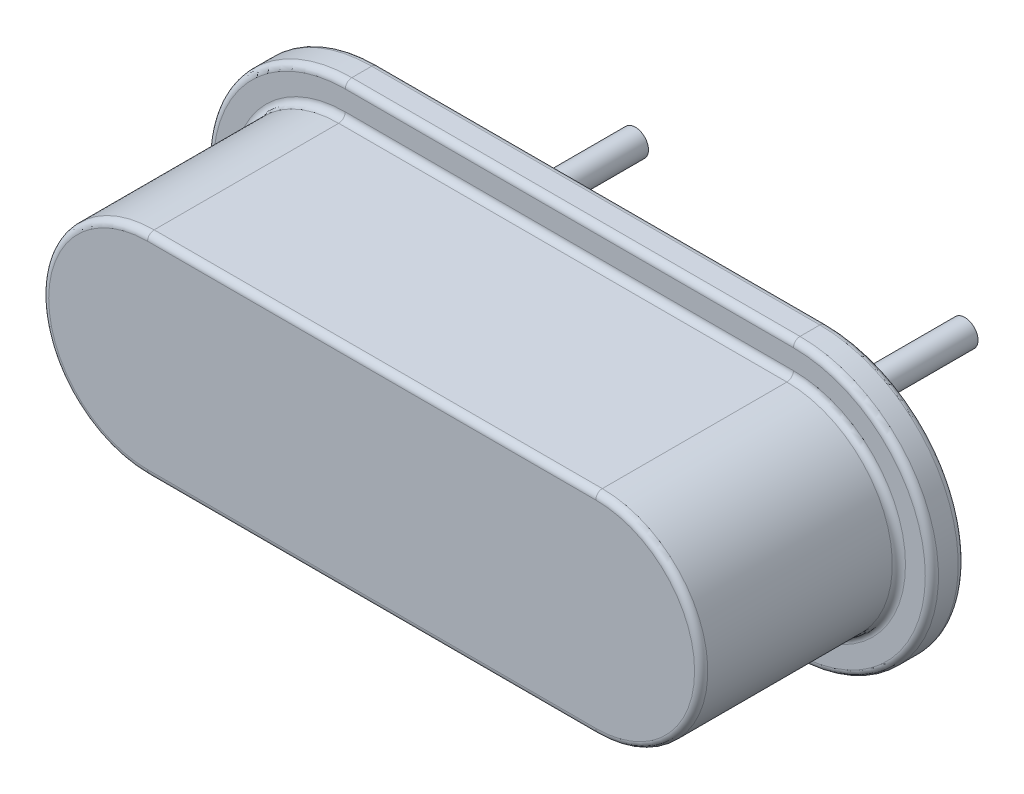
ISO-10303-21;
HEADER;
FILE_DESCRIPTION(('STEP AP214'),'2;1');
FILE_NAME('part.step','',(''),(''),'','','');
FILE_SCHEMA(('AUTOMOTIVE_DESIGN { 1 0 10303 214 1 1 1 1 }'));
ENDSEC;
DATA;
#1=APPLICATION_CONTEXT('core data for automotive mechanical design processes');
#2=APPLICATION_PROTOCOL_DEFINITION('international standard','automotive_design',2000,#1);
#3=PRODUCT_CONTEXT('',#1,'mechanical');
#4=PRODUCT('Part','Part','',(#3));
#5=PRODUCT_RELATED_PRODUCT_CATEGORY('part','',(#4));
#6=PRODUCT_DEFINITION_FORMATION('','',#4);
#7=PRODUCT_DEFINITION_CONTEXT('part definition',#1,'design');
#8=PRODUCT_DEFINITION('design','',#6,#7);
#9=PRODUCT_DEFINITION_SHAPE('','',#8);
#10=(LENGTH_UNIT() NAMED_UNIT(*) SI_UNIT(.MILLI.,.METRE.));
#11=(NAMED_UNIT(*) PLANE_ANGLE_UNIT() SI_UNIT($,.RADIAN.));
#12=(NAMED_UNIT(*) SI_UNIT($,.STERADIAN.) SOLID_ANGLE_UNIT());
#13=UNCERTAINTY_MEASURE_WITH_UNIT(LENGTH_MEASURE(1.E-05),#10,'distance_accuracy_value','');
#14=(GEOMETRIC_REPRESENTATION_CONTEXT(3) GLOBAL_UNCERTAINTY_ASSIGNED_CONTEXT((#13)) GLOBAL_UNIT_ASSIGNED_CONTEXT((#10,
#11,#12)) REPRESENTATION_CONTEXT('',''));
#15=CARTESIAN_POINT('',(0.,0.,0.));
#16=DIRECTION('',(0.,0.,1.));
#17=DIRECTION('',(1.,0.,0.));
#18=AXIS2_PLACEMENT_3D('',#15,#16,#17);
#19=CARTESIAN_POINT('',(3.4,0.,0.));
#20=DIRECTION('',(0.,0.,1.));
#21=DIRECTION('',(1.,0.,0.));
#22=AXIS2_PLACEMENT_3D('',#19,#20,#21);
#23=PLANE('',#22);
#24=DIRECTION('',(1.,0.,0.));
#25=VECTOR('',#24,1.);
#26=CARTESIAN_POINT('',(3.4,-2.,0.));
#27=LINE('',#26,#25);
#28=CARTESIAN_POINT('',(3.4,-2.,0.));
#29=VERTEX_POINT('',#28);
#30=CARTESIAN_POINT('',(-3.4,-2.,0.));
#31=VERTEX_POINT('',#30);
#32=EDGE_CURVE('E282',#29,#31,#27,.F.);
#33=ORIENTED_EDGE('',*,*,#32,.T.);
#34=CARTESIAN_POINT('',(-3.4,0.,0.));
#35=DIRECTION('',(0.,0.,1.));
#36=DIRECTION('',(1.,0.,0.));
#37=AXIS2_PLACEMENT_3D('',#34,#35,#36);
#38=CIRCLE('',#37,2.);
#39=CARTESIAN_POINT('',(-3.4,2.,0.));
#40=VERTEX_POINT('',#39);
#41=EDGE_CURVE('E288',#31,#40,#38,.F.);
#42=ORIENTED_EDGE('',*,*,#41,.T.);
#43=DIRECTION('',(-1.,0.,0.));
#44=VECTOR('',#43,1.);
#45=CARTESIAN_POINT('',(3.4,2.,0.));
#46=LINE('',#45,#44);
#47=CARTESIAN_POINT('',(3.4,2.,0.));
#48=VERTEX_POINT('',#47);
#49=EDGE_CURVE('E286',#40,#48,#46,.F.);
#50=ORIENTED_EDGE('',*,*,#49,.T.);
#51=CARTESIAN_POINT('',(3.4,0.,0.));
#52=DIRECTION('',(0.,0.,1.));
#53=DIRECTION('',(1.,0.,0.));
#54=AXIS2_PLACEMENT_3D('',#51,#52,#53);
#55=CIRCLE('',#54,2.);
#56=EDGE_CURVE('E284',#48,#29,#55,.F.);
#57=ORIENTED_EDGE('',*,*,#56,.T.);
#58=EDGE_LOOP('',(#33,#42,#50,#57));
#59=FACE_BOUND('',#58,.T.);
#60=CARTESIAN_POINT('',(2.49999999999995,0.,0.));
#61=DIRECTION('',(0.,0.,1.));
#62=DIRECTION('',(1.,0.,0.));
#63=AXIS2_PLACEMENT_3D('',#60,#61,#62);
#64=CIRCLE('',#63,0.2);
#65=CARTESIAN_POINT('',(2.69999999999995,0.,0.));
#66=VERTEX_POINT('',#65);
#67=EDGE_CURVE('E276',#66,#66,#64,.F.);
#68=ORIENTED_EDGE('',*,*,#67,.F.);
#69=EDGE_LOOP('',(#68));
#70=FACE_BOUND('',#69,.T.);
#71=CARTESIAN_POINT('',(-2.49999999999995,0.,0.));
#72=DIRECTION('',(0.,0.,1.));
#73=DIRECTION('',(1.,0.,0.));
#74=AXIS2_PLACEMENT_3D('',#71,#72,#73);
#75=CIRCLE('',#74,0.2);
#76=CARTESIAN_POINT('',(-2.29999999999995,0.,0.));
#77=VERTEX_POINT('',#76);
#78=EDGE_CURVE('E186',#77,#77,#75,.F.);
#79=ORIENTED_EDGE('',*,*,#78,.F.);
#80=EDGE_LOOP('',(#79));
#81=FACE_BOUND('',#80,.T.);
#82=ADVANCED_FACE('F35',(#59,#70,#81),#23,.F.);
#83=CARTESIAN_POINT('',(3.4,0.,0.5));
#84=DIRECTION('',(0.,0.,1.));
#85=DIRECTION('',(1.,0.,0.));
#86=AXIS2_PLACEMENT_3D('',#83,#84,#85);
#87=PLANE('',#86);
#88=DIRECTION('',(-1.,0.,0.));
#89=VECTOR('',#88,1.);
#90=CARTESIAN_POINT('',(-3.4,2.,0.5));
#91=LINE('',#90,#89);
#92=CARTESIAN_POINT('',(3.4,2.,0.5));
#93=VERTEX_POINT('',#92);
#94=CARTESIAN_POINT('',(-3.4,2.,0.5));
#95=VERTEX_POINT('',#94);
#96=EDGE_CURVE('E311',#93,#95,#91,.T.);
#97=ORIENTED_EDGE('',*,*,#96,.T.);
#98=CARTESIAN_POINT('',(-3.4,0.,0.5));
#99=DIRECTION('',(0.,0.,1.));
#100=DIRECTION('',(1.,0.,0.));
#101=AXIS2_PLACEMENT_3D('',#98,#99,#100);
#102=CIRCLE('',#101,2.);
#103=CARTESIAN_POINT('',(-3.4,-2.,0.5));
#104=VERTEX_POINT('',#103);
#105=EDGE_CURVE('E313',#95,#104,#102,.T.);
#106=ORIENTED_EDGE('',*,*,#105,.T.);
#107=DIRECTION('',(1.,0.,0.));
#108=VECTOR('',#107,1.);
#109=CARTESIAN_POINT('',(3.4,-2.,0.5));
#110=LINE('',#109,#108);
#111=CARTESIAN_POINT('',(3.4,-2.,0.5));
#112=VERTEX_POINT('',#111);
#113=EDGE_CURVE('E189',#104,#112,#110,.T.);
#114=ORIENTED_EDGE('',*,*,#113,.T.);
#115=CARTESIAN_POINT('',(3.4,0.,0.5));
#116=DIRECTION('',(0.,0.,1.));
#117=DIRECTION('',(1.,0.,0.));
#118=AXIS2_PLACEMENT_3D('',#115,#116,#117);
#119=CIRCLE('',#118,2.);
#120=EDGE_CURVE('E309',#112,#93,#119,.T.);
#121=ORIENTED_EDGE('',*,*,#120,.T.);
#122=EDGE_LOOP('',(#97,#106,#114,#121));
#123=FACE_BOUND('',#122,.T.);
#124=DIRECTION('',(1.,0.,0.));
#125=VECTOR('',#124,1.);
#126=CARTESIAN_POINT('',(3.4,-1.7,0.5));
#127=LINE('',#126,#125);
#128=CARTESIAN_POINT('',(3.4,-1.7,0.5));
#129=VERTEX_POINT('',#128);
#130=CARTESIAN_POINT('',(-3.39999999999999,-1.7,0.5));
#131=VERTEX_POINT('',#130);
#132=EDGE_CURVE('E299',#129,#131,#127,.F.);
#133=ORIENTED_EDGE('',*,*,#132,.T.);
#134=CARTESIAN_POINT('',(-3.4,0.,0.5));
#135=DIRECTION('',(0.,0.,1.));
#136=DIRECTION('',(1.,0.,0.));
#137=AXIS2_PLACEMENT_3D('',#134,#135,#136);
#138=CIRCLE('',#137,1.7);
#139=CARTESIAN_POINT('',(-3.40000000000001,1.7,0.5));
#140=VERTEX_POINT('',#139);
#141=EDGE_CURVE('E305',#131,#140,#138,.F.);
#142=ORIENTED_EDGE('',*,*,#141,.T.);
#143=DIRECTION('',(-1.,0.,0.));
#144=VECTOR('',#143,1.);
#145=CARTESIAN_POINT('',(3.4,1.7,0.5));
#146=LINE('',#145,#144);
#147=CARTESIAN_POINT('',(3.4,1.7,0.5));
#148=VERTEX_POINT('',#147);
#149=EDGE_CURVE('E303',#140,#148,#146,.F.);
#150=ORIENTED_EDGE('',*,*,#149,.T.);
#151=CARTESIAN_POINT('',(3.4,0.,0.5));
#152=DIRECTION('',(0.,0.,1.));
#153=DIRECTION('',(1.,0.,0.));
#154=AXIS2_PLACEMENT_3D('',#151,#152,#153);
#155=CIRCLE('',#154,1.7);
#156=EDGE_CURVE('E301',#148,#129,#155,.F.);
#157=ORIENTED_EDGE('',*,*,#156,.T.);
#158=EDGE_LOOP('',(#133,#142,#150,#157));
#159=FACE_BOUND('',#158,.T.);
#160=ADVANCED_FACE('F364',(#123,#159),#87,.T.);
#161=CARTESIAN_POINT('',(3.4,0.,0.5));
#162=DIRECTION('',(0.,0.,-1.));
#163=DIRECTION('',(-1.,0.,0.));
#164=AXIS2_PLACEMENT_3D('',#161,#162,#163);
#165=CYLINDRICAL_SURFACE('',#164,2.1);
#166=DIRECTION('',(0.,0.,-1.));
#167=VECTOR('',#166,1.);
#168=CARTESIAN_POINT('',(3.4,-2.1,0.5));
#169=LINE('',#168,#167);
#170=CARTESIAN_POINT('',(3.4,-2.1,0.4));
#171=VERTEX_POINT('',#170);
#172=CARTESIAN_POINT('',(3.4,-2.1,0.1));
#173=VERTEX_POINT('',#172);
#174=EDGE_CURVE('E158',#171,#173,#169,.T.);
#175=ORIENTED_EDGE('',*,*,#174,.T.);
#176=CARTESIAN_POINT('',(3.4,0.,0.1));
#177=DIRECTION('',(0.,0.,1.));
#178=DIRECTION('',(1.,0.,0.));
#179=AXIS2_PLACEMENT_3D('',#176,#177,#178);
#180=CIRCLE('',#179,2.1);
#181=CARTESIAN_POINT('',(3.4,2.1,0.1));
#182=VERTEX_POINT('',#181);
#183=EDGE_CURVE('E297',#173,#182,#180,.T.);
#184=ORIENTED_EDGE('',*,*,#183,.T.);
#185=DIRECTION('',(0.,0.,-1.));
#186=VECTOR('',#185,1.);
#187=CARTESIAN_POINT('',(3.4,2.1,0.5));
#188=LINE('',#187,#186);
#189=CARTESIAN_POINT('',(3.4,2.1,0.4));
#190=VERTEX_POINT('',#189);
#191=EDGE_CURVE('E273',#190,#182,#188,.T.);
#192=ORIENTED_EDGE('',*,*,#191,.F.);
#193=CARTESIAN_POINT('',(3.4,0.,0.4));
#194=DIRECTION('',(0.,0.,1.));
#195=DIRECTION('',(1.,0.,0.));
#196=AXIS2_PLACEMENT_3D('',#193,#194,#195);
#197=CIRCLE('',#196,2.1);
#198=EDGE_CURVE('E295',#190,#171,#197,.F.);
#199=ORIENTED_EDGE('',*,*,#198,.T.);
#200=EDGE_LOOP('',(#175,#184,#192,#199));
#201=FACE_BOUND('',#200,.T.);
#202=ADVANCED_FACE('F366',(#201),#165,.T.);
#203=CARTESIAN_POINT('',(3.4,2.1,0.5));
#204=DIRECTION('',(0.,-1.,0.));
#205=DIRECTION('',(0.,0.,-1.));
#206=AXIS2_PLACEMENT_3D('',#203,#204,#205);
#207=PLANE('',#206);
#208=ORIENTED_EDGE('',*,*,#191,.T.);
#209=DIRECTION('',(-1.,0.,0.));
#210=VECTOR('',#209,1.);
#211=CARTESIAN_POINT('',(3.4,2.1,0.1));
#212=LINE('',#211,#210);
#213=CARTESIAN_POINT('',(-3.4,2.1,0.1));
#214=VERTEX_POINT('',#213);
#215=EDGE_CURVE('E293',#182,#214,#212,.T.);
#216=ORIENTED_EDGE('',*,*,#215,.T.);
#217=DIRECTION('',(0.,0.,-1.));
#218=VECTOR('',#217,1.);
#219=CARTESIAN_POINT('',(-3.4,2.1,0.5));
#220=LINE('',#219,#218);
#221=CARTESIAN_POINT('',(-3.4,2.1,0.4));
#222=VERTEX_POINT('',#221);
#223=EDGE_CURVE('E176',#222,#214,#220,.T.);
#224=ORIENTED_EDGE('',*,*,#223,.F.);
#225=DIRECTION('',(-1.,0.,0.));
#226=VECTOR('',#225,1.);
#227=CARTESIAN_POINT('',(3.4,2.1,0.4));
#228=LINE('',#227,#226);
#229=EDGE_CURVE('E291',#222,#190,#228,.F.);
#230=ORIENTED_EDGE('',*,*,#229,.T.);
#231=EDGE_LOOP('',(#208,#216,#224,#230));
#232=FACE_BOUND('',#231,.T.);
#233=ADVANCED_FACE('F373',(#232),#207,.F.);
#234=CARTESIAN_POINT('',(-3.4,0.,0.5));
#235=DIRECTION('',(0.,0.,-1.));
#236=DIRECTION('',(-1.,0.,0.));
#237=AXIS2_PLACEMENT_3D('',#234,#235,#236);
#238=CYLINDRICAL_SURFACE('',#237,2.1);
#239=ORIENTED_EDGE('',*,*,#223,.T.);
#240=CARTESIAN_POINT('',(-3.4,0.,0.1));
#241=DIRECTION('',(0.,0.,1.));
#242=DIRECTION('',(1.,0.,0.));
#243=AXIS2_PLACEMENT_3D('',#240,#241,#242);
#244=CIRCLE('',#243,2.1);
#245=CARTESIAN_POINT('',(-3.4,-2.1,0.1));
#246=VERTEX_POINT('',#245);
#247=EDGE_CURVE('E175',#214,#246,#244,.T.);
#248=ORIENTED_EDGE('',*,*,#247,.T.);
#249=DIRECTION('',(0.,0.,-1.));
#250=VECTOR('',#249,1.);
#251=CARTESIAN_POINT('',(-3.4,-2.1,0.5));
#252=LINE('',#251,#250);
#253=CARTESIAN_POINT('',(-3.4,-2.1,0.4));
#254=VERTEX_POINT('',#253);
#255=EDGE_CURVE('E156',#254,#246,#252,.T.);
#256=ORIENTED_EDGE('',*,*,#255,.F.);
#257=CARTESIAN_POINT('',(-3.4,0.,0.4));
#258=DIRECTION('',(0.,0.,1.));
#259=DIRECTION('',(1.,0.,0.));
#260=AXIS2_PLACEMENT_3D('',#257,#258,#259);
#261=CIRCLE('',#260,2.1);
#262=EDGE_CURVE('E172',#254,#222,#261,.F.);
#263=ORIENTED_EDGE('',*,*,#262,.T.);
#264=EDGE_LOOP('',(#239,#248,#256,#263));
#265=FACE_BOUND('',#264,.T.);
#266=ADVANCED_FACE('F171',(#265),#238,.T.);
#267=CARTESIAN_POINT('',(3.4,-2.1,0.5));
#268=DIRECTION('',(0.,1.,0.));
#269=DIRECTION('',(0.,0.,1.));
#270=AXIS2_PLACEMENT_3D('',#267,#268,#269);
#271=PLANE('',#270);
#272=ORIENTED_EDGE('',*,*,#255,.T.);
#273=DIRECTION('',(1.,0.,0.));
#274=VECTOR('',#273,1.);
#275=CARTESIAN_POINT('',(3.4,-2.1,0.1));
#276=LINE('',#275,#274);
#277=EDGE_CURVE('E163',#246,#173,#276,.T.);
#278=ORIENTED_EDGE('',*,*,#277,.T.);
#279=ORIENTED_EDGE('',*,*,#174,.F.);
#280=DIRECTION('',(1.,0.,0.));
#281=VECTOR('',#280,1.);
#282=CARTESIAN_POINT('',(-3.4,-2.1,0.4));
#283=LINE('',#282,#281);
#284=EDGE_CURVE('E153',#171,#254,#283,.F.);
#285=ORIENTED_EDGE('',*,*,#284,.T.);
#286=EDGE_LOOP('',(#272,#278,#279,#285));
#287=FACE_BOUND('',#286,.T.);
#288=ADVANCED_FACE('F155',(#287),#271,.F.);
#289=CARTESIAN_POINT('',(3.4,0.,3.5));
#290=DIRECTION('',(0.,0.,-1.));
#291=DIRECTION('',(-1.,0.,0.));
#292=AXIS2_PLACEMENT_3D('',#289,#290,#291);
#293=CYLINDRICAL_SURFACE('',#292,1.6);
#294=DIRECTION('',(0.,0.,-1.));
#295=VECTOR('',#294,1.);
#296=CARTESIAN_POINT('',(3.4,-1.6,3.5));
#297=LINE('',#296,#295);
#298=CARTESIAN_POINT('',(3.4,-1.6,3.4));
#299=VERTEX_POINT('',#298);
#300=CARTESIAN_POINT('',(3.4,-1.6,0.6));
#301=VERTEX_POINT('',#300);
#302=EDGE_CURVE('E258',#299,#301,#297,.T.);
#303=ORIENTED_EDGE('',*,*,#302,.T.);
#304=CARTESIAN_POINT('',(3.4,0.,0.6));
#305=DIRECTION('',(0.,0.,1.));
#306=DIRECTION('',(1.,0.,0.));
#307=AXIS2_PLACEMENT_3D('',#304,#305,#306);
#308=CIRCLE('',#307,1.6);
#309=CARTESIAN_POINT('',(3.4,1.6,0.6));
#310=VERTEX_POINT('',#309);
#311=EDGE_CURVE('E325',#301,#310,#308,.T.);
#312=ORIENTED_EDGE('',*,*,#311,.T.);
#313=DIRECTION('',(0.,0.,-1.));
#314=VECTOR('',#313,1.);
#315=CARTESIAN_POINT('',(3.4,1.6,3.5));
#316=LINE('',#315,#314);
#317=CARTESIAN_POINT('',(3.4,1.6,3.4));
#318=VERTEX_POINT('',#317);
#319=EDGE_CURVE('E268',#318,#310,#316,.T.);
#320=ORIENTED_EDGE('',*,*,#319,.F.);
#321=CARTESIAN_POINT('',(3.4,0.,3.4));
#322=DIRECTION('',(0.,0.,1.));
#323=DIRECTION('',(1.,0.,0.));
#324=AXIS2_PLACEMENT_3D('',#321,#322,#323);
#325=CIRCLE('',#324,1.6);
#326=EDGE_CURVE('E225',#318,#299,#325,.F.);
#327=ORIENTED_EDGE('',*,*,#326,.T.);
#328=EDGE_LOOP('',(#303,#312,#320,#327));
#329=FACE_BOUND('',#328,.T.);
#330=ADVANCED_FACE('F356',(#329),#293,.T.);
#331=CARTESIAN_POINT('',(-3.40000000000001,1.6,3.5));
#332=DIRECTION('',(0.,-1.,0.));
#333=DIRECTION('',(0.,0.,-1.));
#334=AXIS2_PLACEMENT_3D('',#331,#332,#333);
#335=PLANE('',#334);
#336=ORIENTED_EDGE('',*,*,#319,.T.);
#337=DIRECTION('',(-1.,0.,0.));
#338=VECTOR('',#337,1.);
#339=CARTESIAN_POINT('',(-3.40000000000001,1.6,0.6));
#340=LINE('',#339,#338);
#341=CARTESIAN_POINT('',(-3.40000000000001,1.6,0.6));
#342=VERTEX_POINT('',#341);
#343=EDGE_CURVE('E322',#310,#342,#340,.T.);
#344=ORIENTED_EDGE('',*,*,#343,.T.);
#345=DIRECTION('',(0.,0.,-1.));
#346=VECTOR('',#345,1.);
#347=CARTESIAN_POINT('',(-3.40000000000001,1.6,3.5));
#348=LINE('',#347,#346);
#349=CARTESIAN_POINT('',(-3.40000000000001,1.6,3.4));
#350=VERTEX_POINT('',#349);
#351=EDGE_CURVE('E265',#350,#342,#348,.T.);
#352=ORIENTED_EDGE('',*,*,#351,.F.);
#353=DIRECTION('',(-1.,0.,0.));
#354=VECTOR('',#353,1.);
#355=CARTESIAN_POINT('',(3.4,1.6,3.4));
#356=LINE('',#355,#354);
#357=EDGE_CURVE('E320',#350,#318,#356,.F.);
#358=ORIENTED_EDGE('',*,*,#357,.T.);
#359=EDGE_LOOP('',(#336,#344,#352,#358));
#360=FACE_BOUND('',#359,.T.);
#361=ADVANCED_FACE('F340',(#360),#335,.F.);
#362=CARTESIAN_POINT('',(-3.4,0.,3.5));
#363=DIRECTION('',(0.,0.,-1.));
#364=DIRECTION('',(-1.,0.,0.));
#365=AXIS2_PLACEMENT_3D('',#362,#363,#364);
#366=CYLINDRICAL_SURFACE('',#365,1.6);
#367=ORIENTED_EDGE('',*,*,#351,.T.);
#368=CARTESIAN_POINT('',(-3.4,0.,0.6));
#369=DIRECTION('',(0.,0.,1.));
#370=DIRECTION('',(1.,0.,0.));
#371=AXIS2_PLACEMENT_3D('',#368,#369,#370);
#372=CIRCLE('',#371,1.6);
#373=CARTESIAN_POINT('',(-3.39999999999999,-1.6,0.6));
#374=VERTEX_POINT('',#373);
#375=EDGE_CURVE('E317',#342,#374,#372,.T.);
#376=ORIENTED_EDGE('',*,*,#375,.T.);
#377=DIRECTION('',(0.,0.,-1.));
#378=VECTOR('',#377,1.);
#379=CARTESIAN_POINT('',(-3.39999999999999,-1.6,3.5));
#380=LINE('',#379,#378);
#381=CARTESIAN_POINT('',(-3.39999999999999,-1.6,3.4));
#382=VERTEX_POINT('',#381);
#383=EDGE_CURVE('E263',#382,#374,#380,.T.);
#384=ORIENTED_EDGE('',*,*,#383,.F.);
#385=CARTESIAN_POINT('',(-3.4,0.,3.4));
#386=DIRECTION('',(0.,0.,1.));
#387=DIRECTION('',(1.,0.,0.));
#388=AXIS2_PLACEMENT_3D('',#385,#386,#387);
#389=CIRCLE('',#388,1.6);
#390=EDGE_CURVE('E315',#382,#350,#389,.F.);
#391=ORIENTED_EDGE('',*,*,#390,.T.);
#392=EDGE_LOOP('',(#367,#376,#384,#391));
#393=FACE_BOUND('',#392,.T.);
#394=ADVANCED_FACE('F338',(#393),#366,.T.);
#395=CARTESIAN_POINT('',(-3.39999999999999,-1.6,3.5));
#396=DIRECTION('',(0.,1.,0.));
#397=DIRECTION('',(0.,0.,1.));
#398=AXIS2_PLACEMENT_3D('',#395,#396,#397);
#399=PLANE('',#398);
#400=ORIENTED_EDGE('',*,*,#383,.T.);
#401=DIRECTION('',(1.,0.,0.));
#402=VECTOR('',#401,1.);
#403=CARTESIAN_POINT('',(-3.39999999999999,-1.6,0.6));
#404=LINE('',#403,#402);
#405=EDGE_CURVE('E11',#374,#301,#404,.T.);
#406=ORIENTED_EDGE('',*,*,#405,.T.);
#407=ORIENTED_EDGE('',*,*,#302,.F.);
#408=DIRECTION('',(1.,0.,0.));
#409=VECTOR('',#408,1.);
#410=CARTESIAN_POINT('',(-3.39999999999999,-1.6,3.4));
#411=LINE('',#410,#409);
#412=EDGE_CURVE('E44',#299,#382,#411,.F.);
#413=ORIENTED_EDGE('',*,*,#412,.T.);
#414=EDGE_LOOP('',(#400,#406,#407,#413));
#415=FACE_BOUND('',#414,.T.);
#416=ADVANCED_FACE('F352',(#415),#399,.F.);
#417=CARTESIAN_POINT('',(3.4,0.,3.5));
#418=DIRECTION('',(0.,0.,1.));
#419=DIRECTION('',(1.,0.,0.));
#420=AXIS2_PLACEMENT_3D('',#417,#418,#419);
#421=PLANE('',#420);
#422=CARTESIAN_POINT('',(3.4,0.,3.5));
#423=DIRECTION('',(0.,0.,1.));
#424=DIRECTION('',(1.,0.,0.));
#425=AXIS2_PLACEMENT_3D('',#422,#423,#424);
#426=CIRCLE('',#425,1.5);
#427=CARTESIAN_POINT('',(3.4,-1.5,3.5));
#428=VERTEX_POINT('',#427);
#429=CARTESIAN_POINT('',(3.4,1.5,3.5));
#430=VERTEX_POINT('',#429);
#431=EDGE_CURVE('E52',#428,#430,#426,.T.);
#432=ORIENTED_EDGE('',*,*,#431,.T.);
#433=DIRECTION('',(-1.,0.,0.));
#434=VECTOR('',#433,1.);
#435=CARTESIAN_POINT('',(-3.40000000000001,1.5,3.5));
#436=LINE('',#435,#434);
#437=CARTESIAN_POINT('',(-3.40000000000001,1.5,3.5));
#438=VERTEX_POINT('',#437);
#439=EDGE_CURVE('E164',#430,#438,#436,.T.);
#440=ORIENTED_EDGE('',*,*,#439,.T.);
#441=CARTESIAN_POINT('',(-3.4,0.,3.5));
#442=DIRECTION('',(0.,0.,1.));
#443=DIRECTION('',(1.,0.,0.));
#444=AXIS2_PLACEMENT_3D('',#441,#442,#443);
#445=CIRCLE('',#444,1.5);
#446=CARTESIAN_POINT('',(-3.39999999999999,-1.5,3.5));
#447=VERTEX_POINT('',#446);
#448=EDGE_CURVE('E328',#438,#447,#445,.T.);
#449=ORIENTED_EDGE('',*,*,#448,.T.);
#450=DIRECTION('',(1.,0.,0.));
#451=VECTOR('',#450,1.);
#452=CARTESIAN_POINT('',(3.4,-1.5,3.5));
#453=LINE('',#452,#451);
#454=EDGE_CURVE('E230',#447,#428,#453,.T.);
#455=ORIENTED_EDGE('',*,*,#454,.T.);
#456=EDGE_LOOP('',(#432,#440,#449,#455));
#457=FACE_BOUND('',#456,.T.);
#458=ADVANCED_FACE('F331',(#457),#421,.T.);
#459=CARTESIAN_POINT('',(2.49999999999995,0.,-3.));
#460=DIRECTION('',(0.,0.,1.));
#461=DIRECTION('',(1.,0.,0.));
#462=AXIS2_PLACEMENT_3D('',#459,#460,#461);
#463=CYLINDRICAL_SURFACE('',#462,0.2);
#464=CARTESIAN_POINT('',(2.49999999999995,0.,-3.));
#465=DIRECTION('',(0.,0.,-1.));
#466=DIRECTION('',(-1.,0.,0.));
#467=AXIS2_PLACEMENT_3D('',#464,#465,#466);
#468=CIRCLE('',#467,0.2);
#469=CARTESIAN_POINT('',(2.29999999999995,0.,-3.));
#470=VERTEX_POINT('',#469);
#471=EDGE_CURVE('E253',#470,#470,#468,.T.);
#472=ORIENTED_EDGE('',*,*,#471,.F.);
#473=EDGE_LOOP('',(#472));
#474=FACE_BOUND('',#473,.T.);
#475=ORIENTED_EDGE('',*,*,#67,.T.);
#476=EDGE_LOOP('',(#475));
#477=FACE_BOUND('',#476,.T.);
#478=ADVANCED_FACE('F503',(#474,#477),#463,.T.);
#479=CARTESIAN_POINT('',(2.49999999999995,0.,-3.));
#480=DIRECTION('',(0.,0.,-1.));
#481=DIRECTION('',(-1.,0.,0.));
#482=AXIS2_PLACEMENT_3D('',#479,#480,#481);
#483=PLANE('',#482);
#484=ORIENTED_EDGE('',*,*,#471,.T.);
#485=EDGE_LOOP('',(#484));
#486=FACE_BOUND('',#485,.T.);
#487=ADVANCED_FACE('F495',(#486),#483,.T.);
#488=CARTESIAN_POINT('',(-2.49999999999995,0.,-3.));
#489=DIRECTION('',(0.,0.,1.));
#490=DIRECTION('',(1.,0.,0.));
#491=AXIS2_PLACEMENT_3D('',#488,#489,#490);
#492=CYLINDRICAL_SURFACE('',#491,0.2);
#493=CARTESIAN_POINT('',(-2.49999999999995,0.,-3.));
#494=DIRECTION('',(0.,0.,-1.));
#495=DIRECTION('',(1.,0.,0.));
#496=AXIS2_PLACEMENT_3D('',#493,#494,#495);
#497=CIRCLE('',#496,0.2);
#498=CARTESIAN_POINT('',(-2.29999999999995,0.,-3.));
#499=VERTEX_POINT('',#498);
#500=EDGE_CURVE('E247',#499,#499,#497,.T.);
#501=ORIENTED_EDGE('',*,*,#500,.F.);
#502=EDGE_LOOP('',(#501));
#503=FACE_BOUND('',#502,.T.);
#504=ORIENTED_EDGE('',*,*,#78,.T.);
#505=EDGE_LOOP('',(#504));
#506=FACE_BOUND('',#505,.T.);
#507=ADVANCED_FACE('F487',(#503,#506),#492,.T.);
#508=CARTESIAN_POINT('',(-2.49999999999995,0.,-3.));
#509=DIRECTION('',(0.,0.,1.));
#510=DIRECTION('',(1.,0.,0.));
#511=AXIS2_PLACEMENT_3D('',#508,#509,#510);
#512=PLANE('',#511);
#513=ORIENTED_EDGE('',*,*,#500,.T.);
#514=EDGE_LOOP('',(#513));
#515=FACE_BOUND('',#514,.T.);
#516=ADVANCED_FACE('F402',(#515),#512,.F.);
#517=CARTESIAN_POINT('',(3.4,0.,0.1));
#518=DIRECTION('',(0.,0.,1.));
#519=DIRECTION('',(1.,0.,0.));
#520=AXIS2_PLACEMENT_3D('',#517,#518,#519);
#521=TOROIDAL_SURFACE('',#520,2.,0.1);
#522=CARTESIAN_POINT('',(3.4,-2.,0.1));
#523=DIRECTION('',(-1.,0.,0.));
#524=DIRECTION('',(0.,0.,1.));
#525=AXIS2_PLACEMENT_3D('',#522,#523,#524);
#526=CIRCLE('',#525,0.1);
#527=EDGE_CURVE('E240',#29,#173,#526,.T.);
#528=ORIENTED_EDGE('',*,*,#527,.F.);
#529=ORIENTED_EDGE('',*,*,#56,.F.);
#530=CARTESIAN_POINT('',(3.4,2.,0.1));
#531=DIRECTION('',(-1.,0.,0.));
#532=DIRECTION('',(0.,0.,1.));
#533=AXIS2_PLACEMENT_3D('',#530,#531,#532);
#534=CIRCLE('',#533,0.1);
#535=EDGE_CURVE('E199',#182,#48,#534,.T.);
#536=ORIENTED_EDGE('',*,*,#535,.F.);
#537=ORIENTED_EDGE('',*,*,#183,.F.);
#538=EDGE_LOOP('',(#528,#529,#536,#537));
#539=FACE_BOUND('',#538,.T.);
#540=ADVANCED_FACE('F399',(#539),#521,.T.);
#541=CARTESIAN_POINT('',(3.4,2.,0.1));
#542=DIRECTION('',(-1.,0.,0.));
#543=DIRECTION('',(0.,0.,1.));
#544=AXIS2_PLACEMENT_3D('',#541,#542,#543);
#545=CYLINDRICAL_SURFACE('',#544,0.1);
#546=ORIENTED_EDGE('',*,*,#535,.T.);
#547=ORIENTED_EDGE('',*,*,#49,.F.);
#548=CARTESIAN_POINT('',(-3.4,2.,0.1));
#549=DIRECTION('',(-1.,0.,0.));
#550=DIRECTION('',(0.,0.,1.));
#551=AXIS2_PLACEMENT_3D('',#548,#549,#550);
#552=CIRCLE('',#551,0.1);
#553=EDGE_CURVE('E239',#214,#40,#552,.T.);
#554=ORIENTED_EDGE('',*,*,#553,.F.);
#555=ORIENTED_EDGE('',*,*,#215,.F.);
#556=EDGE_LOOP('',(#546,#547,#554,#555));
#557=FACE_BOUND('',#556,.T.);
#558=ADVANCED_FACE('F396',(#557),#545,.T.);
#559=CARTESIAN_POINT('',(3.4,-2.,0.1));
#560=DIRECTION('',(1.,0.,0.));
#561=DIRECTION('',(0.,0.,-1.));
#562=AXIS2_PLACEMENT_3D('',#559,#560,#561);
#563=CYLINDRICAL_SURFACE('',#562,0.1);
#564=ORIENTED_EDGE('',*,*,#527,.T.);
#565=ORIENTED_EDGE('',*,*,#277,.F.);
#566=CARTESIAN_POINT('',(-3.4,-2.,0.1));
#567=DIRECTION('',(-1.,0.,0.));
#568=DIRECTION('',(0.,0.,1.));
#569=AXIS2_PLACEMENT_3D('',#566,#567,#568);
#570=CIRCLE('',#569,0.1);
#571=EDGE_CURVE('E206',#31,#246,#570,.T.);
#572=ORIENTED_EDGE('',*,*,#571,.F.);
#573=ORIENTED_EDGE('',*,*,#32,.F.);
#574=EDGE_LOOP('',(#564,#565,#572,#573));
#575=FACE_BOUND('',#574,.T.);
#576=ADVANCED_FACE('F392',(#575),#563,.T.);
#577=CARTESIAN_POINT('',(-3.4,0.,0.1));
#578=DIRECTION('',(0.,0.,1.));
#579=DIRECTION('',(1.,0.,0.));
#580=AXIS2_PLACEMENT_3D('',#577,#578,#579);
#581=TOROIDAL_SURFACE('',#580,2.,0.1);
#582=ORIENTED_EDGE('',*,*,#553,.T.);
#583=ORIENTED_EDGE('',*,*,#41,.F.);
#584=ORIENTED_EDGE('',*,*,#571,.T.);
#585=ORIENTED_EDGE('',*,*,#247,.F.);
#586=EDGE_LOOP('',(#582,#583,#584,#585));
#587=FACE_BOUND('',#586,.T.);
#588=ADVANCED_FACE('F388',(#587),#581,.T.);
#589=CARTESIAN_POINT('',(3.4,0.,0.4));
#590=DIRECTION('',(0.,0.,1.));
#591=DIRECTION('',(1.,0.,0.));
#592=AXIS2_PLACEMENT_3D('',#589,#590,#591);
#593=TOROIDAL_SURFACE('',#592,2.,0.1);
#594=CARTESIAN_POINT('',(3.4,-2.,0.4));
#595=DIRECTION('',(-1.,0.,0.));
#596=DIRECTION('',(0.,0.,1.));
#597=AXIS2_PLACEMENT_3D('',#594,#595,#596);
#598=CIRCLE('',#597,0.1);
#599=EDGE_CURVE('E193',#171,#112,#598,.T.);
#600=ORIENTED_EDGE('',*,*,#599,.F.);
#601=ORIENTED_EDGE('',*,*,#198,.F.);
#602=CARTESIAN_POINT('',(3.4,2.,0.4));
#603=DIRECTION('',(-1.,0.,0.));
#604=DIRECTION('',(0.,0.,1.));
#605=AXIS2_PLACEMENT_3D('',#602,#603,#604);
#606=CIRCLE('',#605,0.1);
#607=EDGE_CURVE('E203',#93,#190,#606,.T.);
#608=ORIENTED_EDGE('',*,*,#607,.F.);
#609=ORIENTED_EDGE('',*,*,#120,.F.);
#610=EDGE_LOOP('',(#600,#601,#608,#609));
#611=FACE_BOUND('',#610,.T.);
#612=ADVANCED_FACE('F391',(#611),#593,.T.);
#613=CARTESIAN_POINT('',(3.4,2.,0.4));
#614=DIRECTION('',(1.,0.,0.));
#615=DIRECTION('',(0.,0.,-1.));
#616=AXIS2_PLACEMENT_3D('',#613,#614,#615);
#617=CYLINDRICAL_SURFACE('',#616,0.1);
#618=ORIENTED_EDGE('',*,*,#607,.T.);
#619=ORIENTED_EDGE('',*,*,#229,.F.);
#620=CARTESIAN_POINT('',(-3.4,2.,0.4));
#621=DIRECTION('',(-1.,0.,0.));
#622=DIRECTION('',(0.,0.,1.));
#623=AXIS2_PLACEMENT_3D('',#620,#621,#622);
#624=CIRCLE('',#623,0.1);
#625=EDGE_CURVE('E184',#95,#222,#624,.T.);
#626=ORIENTED_EDGE('',*,*,#625,.F.);
#627=ORIENTED_EDGE('',*,*,#96,.F.);
#628=EDGE_LOOP('',(#618,#619,#626,#627));
#629=FACE_BOUND('',#628,.T.);
#630=ADVANCED_FACE('F408',(#629),#617,.T.);
#631=CARTESIAN_POINT('',(3.4,-2.,0.4));
#632=DIRECTION('',(-1.,0.,0.));
#633=DIRECTION('',(0.,0.,1.));
#634=AXIS2_PLACEMENT_3D('',#631,#632,#633);
#635=CYLINDRICAL_SURFACE('',#634,0.1);
#636=ORIENTED_EDGE('',*,*,#599,.T.);
#637=ORIENTED_EDGE('',*,*,#113,.F.);
#638=CARTESIAN_POINT('',(-3.4,-2.,0.4));
#639=DIRECTION('',(-1.,0.,0.));
#640=DIRECTION('',(0.,0.,1.));
#641=AXIS2_PLACEMENT_3D('',#638,#639,#640);
#642=CIRCLE('',#641,0.1);
#643=EDGE_CURVE('E181',#254,#104,#642,.T.);
#644=ORIENTED_EDGE('',*,*,#643,.F.);
#645=ORIENTED_EDGE('',*,*,#284,.F.);
#646=EDGE_LOOP('',(#636,#637,#644,#645));
#647=FACE_BOUND('',#646,.T.);
#648=ADVANCED_FACE('F188',(#647),#635,.T.);
#649=CARTESIAN_POINT('',(-3.4,0.,0.4));
#650=DIRECTION('',(0.,0.,1.));
#651=DIRECTION('',(1.,0.,0.));
#652=AXIS2_PLACEMENT_3D('',#649,#650,#651);
#653=TOROIDAL_SURFACE('',#652,2.,0.1);
#654=ORIENTED_EDGE('',*,*,#625,.T.);
#655=ORIENTED_EDGE('',*,*,#262,.F.);
#656=ORIENTED_EDGE('',*,*,#643,.T.);
#657=ORIENTED_EDGE('',*,*,#105,.F.);
#658=EDGE_LOOP('',(#654,#655,#656,#657));
#659=FACE_BOUND('',#658,.T.);
#660=ADVANCED_FACE('F179',(#659),#653,.T.);
#661=CARTESIAN_POINT('',(3.4,0.,0.6));
#662=DIRECTION('',(0.,0.,1.));
#663=DIRECTION('',(1.,0.,0.));
#664=AXIS2_PLACEMENT_3D('',#661,#662,#663);
#665=TOROIDAL_SURFACE('',#664,1.7,0.1);
#666=CARTESIAN_POINT('',(3.4,-1.7,0.6));
#667=DIRECTION('',(1.,0.,0.));
#668=DIRECTION('',(0.,0.,-1.));
#669=AXIS2_PLACEMENT_3D('',#666,#667,#668);
#670=CIRCLE('',#669,0.1);
#671=EDGE_CURVE('E196',#129,#301,#670,.T.);
#672=ORIENTED_EDGE('',*,*,#671,.F.);
#673=ORIENTED_EDGE('',*,*,#156,.F.);
#674=CARTESIAN_POINT('',(3.4,1.7,0.6));
#675=DIRECTION('',(1.,0.,0.));
#676=DIRECTION('',(0.,0.,-1.));
#677=AXIS2_PLACEMENT_3D('',#674,#675,#676);
#678=CIRCLE('',#677,0.1);
#679=EDGE_CURVE('E191',#310,#148,#678,.T.);
#680=ORIENTED_EDGE('',*,*,#679,.F.);
#681=ORIENTED_EDGE('',*,*,#311,.F.);
#682=EDGE_LOOP('',(#672,#673,#680,#681));
#683=FACE_BOUND('',#682,.T.);
#684=ADVANCED_FACE('F359',(#683),#665,.F.);
#685=CARTESIAN_POINT('',(-3.40000000000001,1.7,0.6));
#686=DIRECTION('',(-1.,0.,0.));
#687=DIRECTION('',(0.,0.,1.));
#688=AXIS2_PLACEMENT_3D('',#685,#686,#687);
#689=CYLINDRICAL_SURFACE('',#688,0.1);
#690=ORIENTED_EDGE('',*,*,#679,.T.);
#691=ORIENTED_EDGE('',*,*,#149,.F.);
#692=CARTESIAN_POINT('',(-3.40000000000001,1.7,0.6));
#693=DIRECTION('',(1.,0.,0.));
#694=DIRECTION('',(0.,0.,-1.));
#695=AXIS2_PLACEMENT_3D('',#692,#693,#694);
#696=CIRCLE('',#695,0.1);
#697=EDGE_CURVE('E209',#342,#140,#696,.T.);
#698=ORIENTED_EDGE('',*,*,#697,.F.);
#699=ORIENTED_EDGE('',*,*,#343,.F.);
#700=EDGE_LOOP('',(#690,#691,#698,#699));
#701=FACE_BOUND('',#700,.T.);
#702=ADVANCED_FACE('F344',(#701),#689,.F.);
#703=CARTESIAN_POINT('',(-3.39999999999999,-1.7,0.6));
#704=DIRECTION('',(1.,0.,0.));
#705=DIRECTION('',(0.,0.,-1.));
#706=AXIS2_PLACEMENT_3D('',#703,#704,#705);
#707=CYLINDRICAL_SURFACE('',#706,0.1);
#708=ORIENTED_EDGE('',*,*,#671,.T.);
#709=ORIENTED_EDGE('',*,*,#405,.F.);
#710=CARTESIAN_POINT('',(-3.39999999999999,-1.7,0.6));
#711=DIRECTION('',(1.,0.,0.));
#712=DIRECTION('',(0.,1.,0.));
#713=AXIS2_PLACEMENT_3D('',#710,#711,#712);
#714=CIRCLE('',#713,0.1);
#715=EDGE_CURVE('E207',#131,#374,#714,.T.);
#716=ORIENTED_EDGE('',*,*,#715,.F.);
#717=ORIENTED_EDGE('',*,*,#132,.F.);
#718=EDGE_LOOP('',(#708,#709,#716,#717));
#719=FACE_BOUND('',#718,.T.);
#720=ADVANCED_FACE('F362',(#719),#707,.F.);
#721=CARTESIAN_POINT('',(-3.4,0.,0.6));
#722=DIRECTION('',(0.,0.,1.));
#723=DIRECTION('',(1.,0.,0.));
#724=AXIS2_PLACEMENT_3D('',#721,#722,#723);
#725=TOROIDAL_SURFACE('',#724,1.7,0.1);
#726=ORIENTED_EDGE('',*,*,#697,.T.);
#727=ORIENTED_EDGE('',*,*,#141,.F.);
#728=ORIENTED_EDGE('',*,*,#715,.T.);
#729=ORIENTED_EDGE('',*,*,#375,.F.);
#730=EDGE_LOOP('',(#726,#727,#728,#729));
#731=FACE_BOUND('',#730,.T.);
#732=ADVANCED_FACE('F349',(#731),#725,.F.);
#733=CARTESIAN_POINT('',(3.4,-1.5,3.4));
#734=DIRECTION('',(-1.,0.,0.));
#735=DIRECTION('',(0.,0.,1.));
#736=AXIS2_PLACEMENT_3D('',#733,#734,#735);
#737=CYLINDRICAL_SURFACE('',#736,0.1);
#738=CARTESIAN_POINT('',(-3.39999999999999,-1.5,3.4));
#739=DIRECTION('',(-1.,0.,0.));
#740=DIRECTION('',(0.,0.,1.));
#741=AXIS2_PLACEMENT_3D('',#738,#739,#740);
#742=CIRCLE('',#741,0.1);
#743=EDGE_CURVE('E215',#382,#447,#742,.T.);
#744=ORIENTED_EDGE('',*,*,#743,.F.);
#745=ORIENTED_EDGE('',*,*,#412,.F.);
#746=CARTESIAN_POINT('',(3.4,-1.5,3.4));
#747=DIRECTION('',(1.,0.,0.));
#748=DIRECTION('',(0.,0.,-1.));
#749=AXIS2_PLACEMENT_3D('',#746,#747,#748);
#750=CIRCLE('',#749,0.1);
#751=EDGE_CURVE('E39',#428,#299,#750,.T.);
#752=ORIENTED_EDGE('',*,*,#751,.F.);
#753=ORIENTED_EDGE('',*,*,#454,.F.);
#754=EDGE_LOOP('',(#744,#745,#752,#753));
#755=FACE_BOUND('',#754,.T.);
#756=ADVANCED_FACE('F37',(#755),#737,.T.);
#757=CARTESIAN_POINT('',(3.4,0.,3.4));
#758=DIRECTION('',(0.,0.,1.));
#759=DIRECTION('',(1.,0.,0.));
#760=AXIS2_PLACEMENT_3D('',#757,#758,#759);
#761=TOROIDAL_SURFACE('',#760,1.5,0.1);
#762=ORIENTED_EDGE('',*,*,#751,.T.);
#763=ORIENTED_EDGE('',*,*,#326,.F.);
#764=CARTESIAN_POINT('',(3.4,1.5,3.4));
#765=DIRECTION('',(-1.,0.,0.));
#766=DIRECTION('',(0.,0.,1.));
#767=AXIS2_PLACEMENT_3D('',#764,#765,#766);
#768=CIRCLE('',#767,0.1);
#769=EDGE_CURVE('E214',#430,#318,#768,.T.);
#770=ORIENTED_EDGE('',*,*,#769,.F.);
#771=ORIENTED_EDGE('',*,*,#431,.F.);
#772=EDGE_LOOP('',(#762,#763,#770,#771));
#773=FACE_BOUND('',#772,.T.);
#774=ADVANCED_FACE('F224',(#773),#761,.T.);
#775=CARTESIAN_POINT('',(-3.4,0.,3.4));
#776=DIRECTION('',(0.,0.,1.));
#777=DIRECTION('',(1.,0.,0.));
#778=AXIS2_PLACEMENT_3D('',#775,#776,#777);
#779=TOROIDAL_SURFACE('',#778,1.5,0.1);
#780=ORIENTED_EDGE('',*,*,#743,.T.);
#781=ORIENTED_EDGE('',*,*,#448,.F.);
#782=CARTESIAN_POINT('',(-3.40000000000001,1.5,3.4));
#783=DIRECTION('',(1.,0.,0.));
#784=DIRECTION('',(0.,0.,-1.));
#785=AXIS2_PLACEMENT_3D('',#782,#783,#784);
#786=CIRCLE('',#785,0.1);
#787=EDGE_CURVE('E60',#350,#438,#786,.T.);
#788=ORIENTED_EDGE('',*,*,#787,.F.);
#789=ORIENTED_EDGE('',*,*,#390,.F.);
#790=EDGE_LOOP('',(#780,#781,#788,#789));
#791=FACE_BOUND('',#790,.T.);
#792=ADVANCED_FACE('F336',(#791),#779,.T.);
#793=CARTESIAN_POINT('',(3.4,1.5,3.4));
#794=DIRECTION('',(1.,0.,0.));
#795=DIRECTION('',(0.,0.,-1.));
#796=AXIS2_PLACEMENT_3D('',#793,#794,#795);
#797=CYLINDRICAL_SURFACE('',#796,0.1);
#798=ORIENTED_EDGE('',*,*,#769,.T.);
#799=ORIENTED_EDGE('',*,*,#357,.F.);
#800=ORIENTED_EDGE('',*,*,#787,.T.);
#801=ORIENTED_EDGE('',*,*,#439,.F.);
#802=EDGE_LOOP('',(#798,#799,#800,#801));
#803=FACE_BOUND('',#802,.T.);
#804=ADVANCED_FACE('F332',(#803),#797,.T.);
#805=CLOSED_SHELL('',(#82,#160,#202,#233,#266,#288,#330,#361,#394,#416,#458,#478,#487,#507,#516,
#540,#558,#576,#588,#612,#630,#648,#660,#684,#702,#720,#732,#756,#774,#792,#804));
#806=MANIFOLD_SOLID_BREP('B2',#805);
#807=ADVANCED_BREP_SHAPE_REPRESENTATION('',(#18,#806),#14);
#808=SHAPE_DEFINITION_REPRESENTATION(#9,#807);
ENDSEC;
END-ISO-10303-21;
